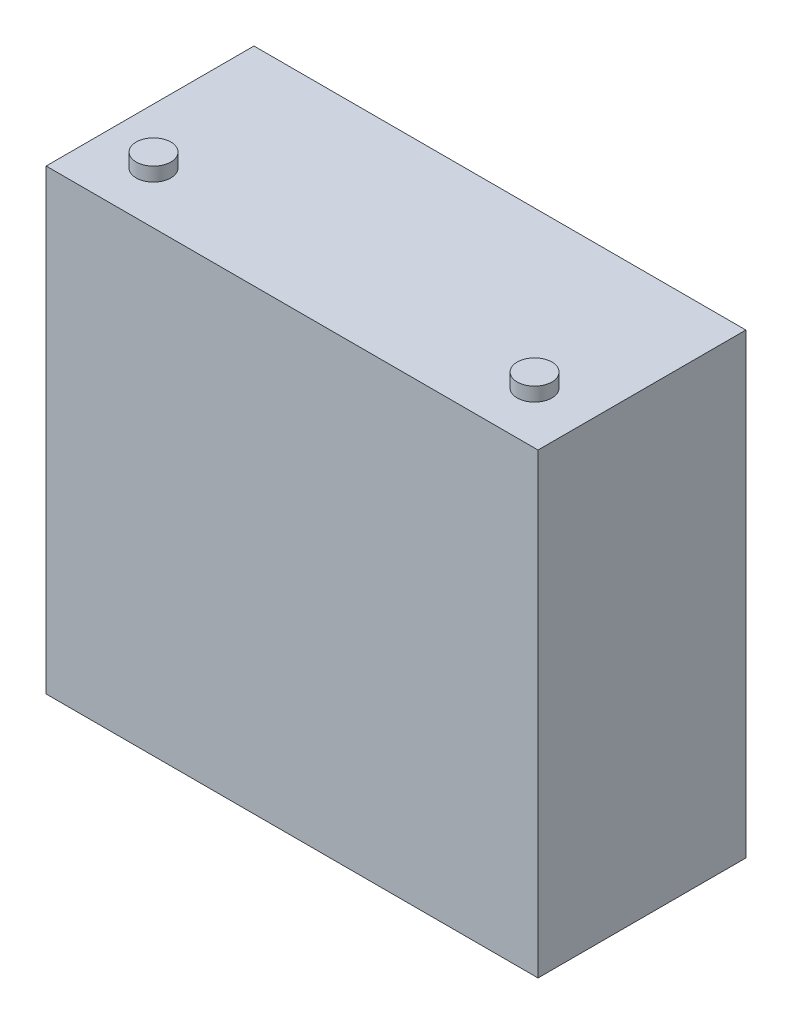
ISO-10303-21;
HEADER;
FILE_DESCRIPTION(('STEP AP214'),'2;1');
FILE_NAME('part.step','',(''),(''),'','','');
FILE_SCHEMA(('AUTOMOTIVE_DESIGN { 1 0 10303 214 1 1 1 1 }'));
ENDSEC;
DATA;
#1=APPLICATION_CONTEXT('core data for automotive mechanical design processes');
#2=APPLICATION_PROTOCOL_DEFINITION('international standard','automotive_design',2000,#1);
#3=PRODUCT_CONTEXT('',#1,'mechanical');
#4=PRODUCT('Part','Part','',(#3));
#5=PRODUCT_RELATED_PRODUCT_CATEGORY('part','',(#4));
#6=PRODUCT_DEFINITION_FORMATION('','',#4);
#7=PRODUCT_DEFINITION_CONTEXT('part definition',#1,'design');
#8=PRODUCT_DEFINITION('design','',#6,#7);
#9=PRODUCT_DEFINITION_SHAPE('','',#8);
#10=(LENGTH_UNIT() NAMED_UNIT(*) SI_UNIT(.MILLI.,.METRE.));
#11=(NAMED_UNIT(*) PLANE_ANGLE_UNIT() SI_UNIT($,.RADIAN.));
#12=(NAMED_UNIT(*) SI_UNIT($,.STERADIAN.) SOLID_ANGLE_UNIT());
#13=UNCERTAINTY_MEASURE_WITH_UNIT(LENGTH_MEASURE(1.E-05),#10,'distance_accuracy_value','');
#14=(GEOMETRIC_REPRESENTATION_CONTEXT(3) GLOBAL_UNCERTAINTY_ASSIGNED_CONTEXT((#13)) GLOBAL_UNIT_ASSIGNED_CONTEXT((#10,
#11,#12)) REPRESENTATION_CONTEXT('',''));
#15=CARTESIAN_POINT('',(0.,0.,0.));
#16=DIRECTION('',(0.,0.,1.));
#17=DIRECTION('',(1.,0.,0.));
#18=AXIS2_PLACEMENT_3D('',#15,#16,#17);
#19=CARTESIAN_POINT('',(90.1699999999999,167.64,38.1));
#20=DIRECTION('',(-1.,0.,0.));
#21=DIRECTION('',(0.,0.,1.));
#22=AXIS2_PLACEMENT_3D('',#19,#20,#21);
#23=PLANE('',#22);
#24=DIRECTION('',(0.,0.,-1.));
#25=VECTOR('',#24,1.);
#26=CARTESIAN_POINT('',(90.1699999999999,0.,38.1));
#27=LINE('',#26,#25);
#28=CARTESIAN_POINT('',(90.1699999999999,0.,38.1));
#29=VERTEX_POINT('',#28);
#30=CARTESIAN_POINT('',(90.1699999999999,0.,-38.1));
#31=VERTEX_POINT('',#30);
#32=EDGE_CURVE('E103',#29,#31,#27,.T.);
#33=ORIENTED_EDGE('',*,*,#32,.T.);
#34=DIRECTION('',(0.,-1.,0.));
#35=VECTOR('',#34,1.);
#36=CARTESIAN_POINT('',(90.1699999999999,167.64,-38.1));
#37=LINE('',#36,#35);
#38=CARTESIAN_POINT('',(90.1699999999999,167.64,-38.1));
#39=VERTEX_POINT('',#38);
#40=EDGE_CURVE('E94',#39,#31,#37,.T.);
#41=ORIENTED_EDGE('',*,*,#40,.F.);
#42=DIRECTION('',(0.,0.,-1.));
#43=VECTOR('',#42,1.);
#44=CARTESIAN_POINT('',(90.1699999999999,167.64,38.1));
#45=LINE('',#44,#43);
#46=CARTESIAN_POINT('',(90.1699999999999,167.64,38.1));
#47=VERTEX_POINT('',#46);
#48=EDGE_CURVE('E88',#47,#39,#45,.T.);
#49=ORIENTED_EDGE('',*,*,#48,.F.);
#50=DIRECTION('',(0.,-1.,0.));
#51=VECTOR('',#50,1.);
#52=CARTESIAN_POINT('',(90.1699999999999,167.64,38.1));
#53=LINE('',#52,#51);
#54=EDGE_CURVE('E99',#47,#29,#53,.T.);
#55=ORIENTED_EDGE('',*,*,#54,.T.);
#56=EDGE_LOOP('',(#33,#41,#49,#55));
#57=FACE_BOUND('',#56,.T.);
#58=ADVANCED_FACE('F36',(#57),#23,.F.);
#59=CARTESIAN_POINT('',(-90.1700000000001,167.64,-38.1));
#60=DIRECTION('',(0.,0.,1.));
#61=DIRECTION('',(1.,0.,0.));
#62=AXIS2_PLACEMENT_3D('',#59,#60,#61);
#63=PLANE('',#62);
#64=DIRECTION('',(-1.,0.,0.));
#65=VECTOR('',#64,1.);
#66=CARTESIAN_POINT('',(-90.1700000000001,0.,-38.1));
#67=LINE('',#66,#65);
#68=CARTESIAN_POINT('',(-90.1700000000001,0.,-38.1));
#69=VERTEX_POINT('',#68);
#70=EDGE_CURVE('E93',#31,#69,#67,.T.);
#71=ORIENTED_EDGE('',*,*,#70,.T.);
#72=DIRECTION('',(0.,-1.,0.));
#73=VECTOR('',#72,1.);
#74=CARTESIAN_POINT('',(-90.1700000000001,167.64,-38.1));
#75=LINE('',#74,#73);
#76=CARTESIAN_POINT('',(-90.1700000000001,167.64,-38.1));
#77=VERTEX_POINT('',#76);
#78=EDGE_CURVE('E91',#77,#69,#75,.T.);
#79=ORIENTED_EDGE('',*,*,#78,.F.);
#80=DIRECTION('',(-1.,0.,0.));
#81=VECTOR('',#80,1.);
#82=CARTESIAN_POINT('',(-90.1700000000001,167.64,-38.1));
#83=LINE('',#82,#81);
#84=EDGE_CURVE('E83',#39,#77,#83,.T.);
#85=ORIENTED_EDGE('',*,*,#84,.F.);
#86=ORIENTED_EDGE('',*,*,#40,.T.);
#87=EDGE_LOOP('',(#71,#79,#85,#86));
#88=FACE_BOUND('',#87,.T.);
#89=ADVANCED_FACE('F92',(#88),#63,.F.);
#90=CARTESIAN_POINT('',(-90.1700000000001,167.64,38.1));
#91=DIRECTION('',(1.,0.,0.));
#92=DIRECTION('',(0.,0.,-1.));
#93=AXIS2_PLACEMENT_3D('',#90,#91,#92);
#94=PLANE('',#93);
#95=DIRECTION('',(0.,0.,1.));
#96=VECTOR('',#95,1.);
#97=CARTESIAN_POINT('',(-90.1700000000001,0.,38.1));
#98=LINE('',#97,#96);
#99=CARTESIAN_POINT('',(-90.1700000000001,0.,38.1));
#100=VERTEX_POINT('',#99);
#101=EDGE_CURVE('E69',#69,#100,#98,.T.);
#102=ORIENTED_EDGE('',*,*,#101,.T.);
#103=DIRECTION('',(0.,-1.,0.));
#104=VECTOR('',#103,1.);
#105=CARTESIAN_POINT('',(-90.1700000000001,167.64,38.1));
#106=LINE('',#105,#104);
#107=CARTESIAN_POINT('',(-90.1700000000001,167.64,38.1));
#108=VERTEX_POINT('',#107);
#109=EDGE_CURVE('E95',#108,#100,#106,.T.);
#110=ORIENTED_EDGE('',*,*,#109,.F.);
#111=DIRECTION('',(0.,0.,1.));
#112=VECTOR('',#111,1.);
#113=CARTESIAN_POINT('',(-90.1700000000001,167.64,38.1));
#114=LINE('',#113,#112);
#115=EDGE_CURVE('E86',#77,#108,#114,.T.);
#116=ORIENTED_EDGE('',*,*,#115,.F.);
#117=ORIENTED_EDGE('',*,*,#78,.T.);
#118=EDGE_LOOP('',(#102,#110,#116,#117));
#119=FACE_BOUND('',#118,.T.);
#120=ADVANCED_FACE('F97',(#119),#94,.F.);
#121=CARTESIAN_POINT('',(-90.1700000000001,167.64,38.1));
#122=DIRECTION('',(0.,0.,-1.));
#123=DIRECTION('',(-1.,0.,0.));
#124=AXIS2_PLACEMENT_3D('',#121,#122,#123);
#125=PLANE('',#124);
#126=DIRECTION('',(1.,0.,0.));
#127=VECTOR('',#126,1.);
#128=CARTESIAN_POINT('',(-90.1700000000001,0.,38.1));
#129=LINE('',#128,#127);
#130=EDGE_CURVE('E75',#100,#29,#129,.T.);
#131=ORIENTED_EDGE('',*,*,#130,.T.);
#132=ORIENTED_EDGE('',*,*,#54,.F.);
#133=DIRECTION('',(1.,0.,0.));
#134=VECTOR('',#133,1.);
#135=CARTESIAN_POINT('',(-90.1700000000001,167.64,38.1));
#136=LINE('',#135,#134);
#137=EDGE_CURVE('E52',#108,#47,#136,.T.);
#138=ORIENTED_EDGE('',*,*,#137,.F.);
#139=ORIENTED_EDGE('',*,*,#109,.T.);
#140=EDGE_LOOP('',(#131,#132,#138,#139));
#141=FACE_BOUND('',#140,.T.);
#142=ADVANCED_FACE('F119',(#141),#125,.F.);
#143=CARTESIAN_POINT('',(0.,167.64,0.));
#144=DIRECTION('',(0.,-1.,0.));
#145=DIRECTION('',(0.,0.,-1.));
#146=AXIS2_PLACEMENT_3D('',#143,#144,#145);
#147=PLANE('',#146);
#148=CARTESIAN_POINT('',(69.85,167.64,19.05));
#149=DIRECTION('',(0.,-1.,0.));
#150=DIRECTION('',(0.,0.,-1.));
#151=AXIS2_PLACEMENT_3D('',#148,#149,#150);
#152=CIRCLE('',#151,6.35);
#153=CARTESIAN_POINT('',(69.85,167.64,12.7));
#154=VERTEX_POINT('',#153);
#155=EDGE_CURVE('E11',#154,#154,#152,.F.);
#156=ORIENTED_EDGE('',*,*,#155,.F.);
#157=EDGE_LOOP('',(#156));
#158=FACE_BOUND('',#157,.T.);
#159=CARTESIAN_POINT('',(-69.85,167.64,19.05));
#160=DIRECTION('',(0.,-1.,0.));
#161=DIRECTION('',(0.,0.,-1.));
#162=AXIS2_PLACEMENT_3D('',#159,#160,#161);
#163=CIRCLE('',#162,6.35);
#164=CARTESIAN_POINT('',(-69.85,167.64,12.7));
#165=VERTEX_POINT('',#164);
#166=EDGE_CURVE('E44',#165,#165,#163,.F.);
#167=ORIENTED_EDGE('',*,*,#166,.F.);
#168=EDGE_LOOP('',(#167));
#169=FACE_BOUND('',#168,.T.);
#170=ORIENTED_EDGE('',*,*,#48,.T.);
#171=ORIENTED_EDGE('',*,*,#84,.T.);
#172=ORIENTED_EDGE('',*,*,#115,.T.);
#173=ORIENTED_EDGE('',*,*,#137,.T.);
#174=EDGE_LOOP('',(#170,#171,#172,#173));
#175=FACE_BOUND('',#174,.T.);
#176=ADVANCED_FACE('F84',(#158,#169,#175),#147,.F.);
#177=CARTESIAN_POINT('',(0.,0.,0.));
#178=DIRECTION('',(0.,-1.,0.));
#179=DIRECTION('',(0.,0.,-1.));
#180=AXIS2_PLACEMENT_3D('',#177,#178,#179);
#181=PLANE('',#180);
#182=ORIENTED_EDGE('',*,*,#32,.F.);
#183=ORIENTED_EDGE('',*,*,#130,.F.);
#184=ORIENTED_EDGE('',*,*,#101,.F.);
#185=ORIENTED_EDGE('',*,*,#70,.F.);
#186=EDGE_LOOP('',(#182,#183,#184,#185));
#187=FACE_BOUND('',#186,.T.);
#188=ADVANCED_FACE('F118',(#187),#181,.T.);
#189=CARTESIAN_POINT('',(-69.85,172.72,19.05));
#190=DIRECTION('',(0.,-1.,0.));
#191=DIRECTION('',(0.,0.,-1.));
#192=AXIS2_PLACEMENT_3D('',#189,#190,#191);
#193=CYLINDRICAL_SURFACE('',#192,6.35);
#194=CARTESIAN_POINT('',(-69.85,172.72,19.05));
#195=DIRECTION('',(0.,1.,0.));
#196=DIRECTION('',(0.,0.,1.));
#197=AXIS2_PLACEMENT_3D('',#194,#195,#196);
#198=CIRCLE('',#197,6.35);
#199=CARTESIAN_POINT('',(-69.85,172.72,25.4));
#200=VERTEX_POINT('',#199);
#201=EDGE_CURVE('E106',#200,#200,#198,.T.);
#202=ORIENTED_EDGE('',*,*,#201,.F.);
#203=EDGE_LOOP('',(#202));
#204=FACE_BOUND('',#203,.T.);
#205=ORIENTED_EDGE('',*,*,#166,.T.);
#206=EDGE_LOOP('',(#205));
#207=FACE_BOUND('',#206,.T.);
#208=ADVANCED_FACE('F115',(#204,#207),#193,.T.);
#209=CARTESIAN_POINT('',(-69.85,172.72,19.05));
#210=DIRECTION('',(0.,1.,0.));
#211=DIRECTION('',(0.,0.,1.));
#212=AXIS2_PLACEMENT_3D('',#209,#210,#211);
#213=PLANE('',#212);
#214=ORIENTED_EDGE('',*,*,#201,.T.);
#215=EDGE_LOOP('',(#214));
#216=FACE_BOUND('',#215,.T.);
#217=ADVANCED_FACE('F149',(#216),#213,.T.);
#218=CARTESIAN_POINT('',(69.85,172.72,19.05));
#219=DIRECTION('',(0.,-1.,0.));
#220=DIRECTION('',(0.,0.,-1.));
#221=AXIS2_PLACEMENT_3D('',#218,#219,#220);
#222=CYLINDRICAL_SURFACE('',#221,6.35);
#223=CARTESIAN_POINT('',(69.85,172.72,19.05));
#224=DIRECTION('',(0.,1.,0.));
#225=DIRECTION('',(0.,0.,1.));
#226=AXIS2_PLACEMENT_3D('',#223,#224,#225);
#227=CIRCLE('',#226,6.35);
#228=CARTESIAN_POINT('',(69.85,172.72,25.4));
#229=VERTEX_POINT('',#228);
#230=EDGE_CURVE('E140',#229,#229,#227,.T.);
#231=ORIENTED_EDGE('',*,*,#230,.F.);
#232=EDGE_LOOP('',(#231));
#233=FACE_BOUND('',#232,.T.);
#234=ORIENTED_EDGE('',*,*,#155,.T.);
#235=EDGE_LOOP('',(#234));
#236=FACE_BOUND('',#235,.T.);
#237=ADVANCED_FACE('F146',(#233,#236),#222,.T.);
#238=CARTESIAN_POINT('',(69.85,172.72,19.05));
#239=DIRECTION('',(0.,1.,0.));
#240=DIRECTION('',(0.,0.,1.));
#241=AXIS2_PLACEMENT_3D('',#238,#239,#240);
#242=PLANE('',#241);
#243=ORIENTED_EDGE('',*,*,#230,.T.);
#244=EDGE_LOOP('',(#243));
#245=FACE_BOUND('',#244,.T.);
#246=ADVANCED_FACE('F144',(#245),#242,.T.);
#247=CLOSED_SHELL('',(#58,#89,#120,#142,#176,#188,#208,#217,#237,#246));
#248=MANIFOLD_SOLID_BREP('B2',#247);
#249=ADVANCED_BREP_SHAPE_REPRESENTATION('',(#18,#248),#14);
#250=SHAPE_DEFINITION_REPRESENTATION(#9,#249);
ENDSEC;
END-ISO-10303-21;
